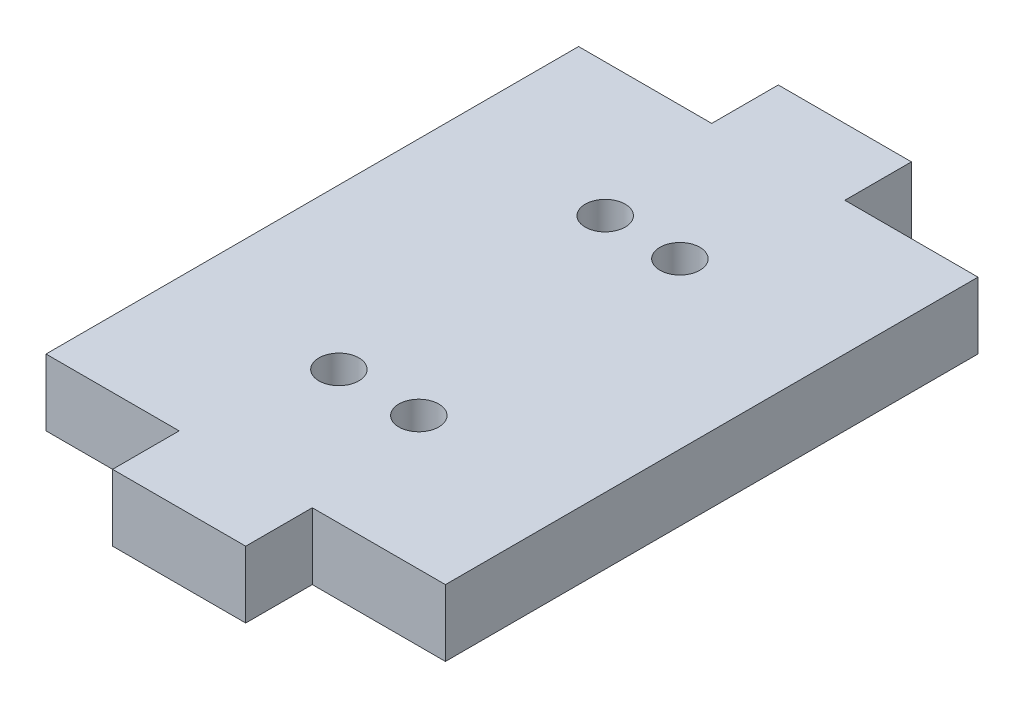
ISO-10303-21;
HEADER;
FILE_DESCRIPTION(('STEP AP214'),'2;1');
FILE_NAME('part.step','',(''),(''),'','','');
FILE_SCHEMA(('AUTOMOTIVE_DESIGN { 1 0 10303 214 1 1 1 1 }'));
ENDSEC;
DATA;
#1=APPLICATION_CONTEXT('core data for automotive mechanical design processes');
#2=APPLICATION_PROTOCOL_DEFINITION('international standard','automotive_design',2000,#1);
#3=PRODUCT_CONTEXT('',#1,'mechanical');
#4=PRODUCT('Part','Part','',(#3));
#5=PRODUCT_RELATED_PRODUCT_CATEGORY('part','',(#4));
#6=PRODUCT_DEFINITION_FORMATION('','',#4);
#7=PRODUCT_DEFINITION_CONTEXT('part definition',#1,'design');
#8=PRODUCT_DEFINITION('design','',#6,#7);
#9=PRODUCT_DEFINITION_SHAPE('','',#8);
#10=(LENGTH_UNIT() NAMED_UNIT(*) SI_UNIT(.MILLI.,.METRE.));
#11=(NAMED_UNIT(*) PLANE_ANGLE_UNIT() SI_UNIT($,.RADIAN.));
#12=(NAMED_UNIT(*) SI_UNIT($,.STERADIAN.) SOLID_ANGLE_UNIT());
#13=UNCERTAINTY_MEASURE_WITH_UNIT(LENGTH_MEASURE(1.E-05),#10,'distance_accuracy_value','');
#14=(GEOMETRIC_REPRESENTATION_CONTEXT(3) GLOBAL_UNCERTAINTY_ASSIGNED_CONTEXT((#13)) GLOBAL_UNIT_ASSIGNED_CONTEXT((#10,
#11,#12)) REPRESENTATION_CONTEXT('',''));
#15=CARTESIAN_POINT('',(0.,0.,0.));
#16=DIRECTION('',(0.,0.,1.));
#17=DIRECTION('',(1.,0.,0.));
#18=AXIS2_PLACEMENT_3D('',#15,#16,#17);
#19=CARTESIAN_POINT('',(0.,5.,0.));
#20=DIRECTION('',(0.,-1.,0.));
#21=DIRECTION('',(0.,0.,-1.));
#22=AXIS2_PLACEMENT_3D('',#19,#20,#21);
#23=PLANE('',#22);
#24=DIRECTION('',(0.,0.,1.));
#25=VECTOR('',#24,1.);
#26=CARTESIAN_POINT('',(0.,5.,0.));
#27=LINE('',#26,#25);
#28=CARTESIAN_POINT('',(0.,5.,-40.));
#29=VERTEX_POINT('',#28);
#30=CARTESIAN_POINT('',(0.,5.,0.));
#31=VERTEX_POINT('',#30);
#32=EDGE_CURVE('E179',#29,#31,#27,.T.);
#33=ORIENTED_EDGE('',*,*,#32,.T.);
#34=DIRECTION('',(1.,0.,0.));
#35=VECTOR('',#34,1.);
#36=CARTESIAN_POINT('',(0.,5.,0.));
#37=LINE('',#36,#35);
#38=CARTESIAN_POINT('',(9.99999999999999,5.,0.));
#39=VERTEX_POINT('',#38);
#40=EDGE_CURVE('E107',#31,#39,#37,.T.);
#41=ORIENTED_EDGE('',*,*,#40,.T.);
#42=DIRECTION('',(0.,0.,1.));
#43=VECTOR('',#42,1.);
#44=CARTESIAN_POINT('',(9.99999999999999,5.,0.));
#45=LINE('',#44,#43);
#46=CARTESIAN_POINT('',(10.,5.,5.));
#47=VERTEX_POINT('',#46);
#48=EDGE_CURVE('E206',#39,#47,#45,.T.);
#49=ORIENTED_EDGE('',*,*,#48,.T.);
#50=DIRECTION('',(1.,0.,0.));
#51=VECTOR('',#50,1.);
#52=CARTESIAN_POINT('',(10.,5.,5.));
#53=LINE('',#52,#51);
#54=CARTESIAN_POINT('',(20.,5.,5.));
#55=VERTEX_POINT('',#54);
#56=EDGE_CURVE('E225',#47,#55,#53,.T.);
#57=ORIENTED_EDGE('',*,*,#56,.T.);
#58=DIRECTION('',(0.,0.,-1.));
#59=VECTOR('',#58,1.);
#60=CARTESIAN_POINT('',(20.,5.,0.));
#61=LINE('',#60,#59);
#62=CARTESIAN_POINT('',(20.,5.,0.));
#63=VERTEX_POINT('',#62);
#64=EDGE_CURVE('E222',#55,#63,#61,.T.);
#65=ORIENTED_EDGE('',*,*,#64,.T.);
#66=DIRECTION('',(1.,0.,0.));
#67=VECTOR('',#66,1.);
#68=CARTESIAN_POINT('',(20.,5.,0.));
#69=LINE('',#68,#67);
#70=CARTESIAN_POINT('',(30.,5.,0.));
#71=VERTEX_POINT('',#70);
#72=EDGE_CURVE('E224',#63,#71,#69,.T.);
#73=ORIENTED_EDGE('',*,*,#72,.T.);
#74=DIRECTION('',(0.,0.,-1.));
#75=VECTOR('',#74,1.);
#76=CARTESIAN_POINT('',(30.,5.,0.));
#77=LINE('',#76,#75);
#78=CARTESIAN_POINT('',(30.,5.,-40.));
#79=VERTEX_POINT('',#78);
#80=EDGE_CURVE('E227',#71,#79,#77,.T.);
#81=ORIENTED_EDGE('',*,*,#80,.T.);
#82=DIRECTION('',(-1.,0.,0.));
#83=VECTOR('',#82,1.);
#84=CARTESIAN_POINT('',(20.,5.,-40.));
#85=LINE('',#84,#83);
#86=CARTESIAN_POINT('',(20.,5.,-40.));
#87=VERTEX_POINT('',#86);
#88=EDGE_CURVE('E233',#79,#87,#85,.T.);
#89=ORIENTED_EDGE('',*,*,#88,.T.);
#90=DIRECTION('',(0.,0.,-1.));
#91=VECTOR('',#90,1.);
#92=CARTESIAN_POINT('',(20.,5.,-40.));
#93=LINE('',#92,#91);
#94=CARTESIAN_POINT('',(20.,5.,-45.));
#95=VERTEX_POINT('',#94);
#96=EDGE_CURVE('E138',#87,#95,#93,.T.);
#97=ORIENTED_EDGE('',*,*,#96,.T.);
#98=DIRECTION('',(-1.,0.,0.));
#99=VECTOR('',#98,1.);
#100=CARTESIAN_POINT('',(9.99999999999999,5.,-45.));
#101=LINE('',#100,#99);
#102=CARTESIAN_POINT('',(9.99999999999999,5.,-45.));
#103=VERTEX_POINT('',#102);
#104=EDGE_CURVE('E132',#95,#103,#101,.T.);
#105=ORIENTED_EDGE('',*,*,#104,.T.);
#106=DIRECTION('',(0.,0.,1.));
#107=VECTOR('',#106,1.);
#108=CARTESIAN_POINT('',(9.99999999999999,5.,-40.));
#109=LINE('',#108,#107);
#110=CARTESIAN_POINT('',(9.99999999999999,5.,-40.));
#111=VERTEX_POINT('',#110);
#112=EDGE_CURVE('E136',#103,#111,#109,.T.);
#113=ORIENTED_EDGE('',*,*,#112,.T.);
#114=DIRECTION('',(-1.,0.,0.));
#115=VECTOR('',#114,1.);
#116=CARTESIAN_POINT('',(0.,5.,-40.));
#117=LINE('',#116,#115);
#118=EDGE_CURVE('E52',#111,#29,#117,.T.);
#119=ORIENTED_EDGE('',*,*,#118,.T.);
#120=EDGE_LOOP('',(#33,#41,#49,#57,#65,#73,#81,#89,#97,#105,#113,#119));
#121=FACE_BOUND('',#120,.T.);
#122=CARTESIAN_POINT('',(12.,5.,-30.));
#123=DIRECTION('',(0.,1.,0.));
#124=DIRECTION('',(0.,0.,1.));
#125=AXIS2_PLACEMENT_3D('',#122,#123,#124);
#126=CIRCLE('',#125,1.5);
#127=CARTESIAN_POINT('',(12.,5.,-28.5));
#128=VERTEX_POINT('',#127);
#129=EDGE_CURVE('E160',#128,#128,#126,.T.);
#130=ORIENTED_EDGE('',*,*,#129,.F.);
#131=EDGE_LOOP('',(#130));
#132=FACE_BOUND('',#131,.T.);
#133=CARTESIAN_POINT('',(17.6105034699835,5.,-30.));
#134=DIRECTION('',(0.,1.,0.));
#135=DIRECTION('',(0.,0.,1.));
#136=AXIS2_PLACEMENT_3D('',#133,#134,#135);
#137=CIRCLE('',#136,1.5);
#138=CARTESIAN_POINT('',(17.6105034699835,5.,-28.5));
#139=VERTEX_POINT('',#138);
#140=EDGE_CURVE('E297',#139,#139,#137,.T.);
#141=ORIENTED_EDGE('',*,*,#140,.F.);
#142=EDGE_LOOP('',(#141));
#143=FACE_BOUND('',#142,.T.);
#144=CARTESIAN_POINT('',(18.,5.,-10.));
#145=DIRECTION('',(0.,1.,0.));
#146=DIRECTION('',(0.,0.,1.));
#147=AXIS2_PLACEMENT_3D('',#144,#145,#146);
#148=CIRCLE('',#147,1.5);
#149=CARTESIAN_POINT('',(18.,5.,-8.5));
#150=VERTEX_POINT('',#149);
#151=EDGE_CURVE('E291',#150,#150,#148,.T.);
#152=ORIENTED_EDGE('',*,*,#151,.F.);
#153=EDGE_LOOP('',(#152));
#154=FACE_BOUND('',#153,.T.);
#155=CARTESIAN_POINT('',(12.,5.,-10.));
#156=DIRECTION('',(0.,1.,0.));
#157=DIRECTION('',(0.,0.,1.));
#158=AXIS2_PLACEMENT_3D('',#155,#156,#157);
#159=CIRCLE('',#158,1.5);
#160=CARTESIAN_POINT('',(12.,5.,-8.5));
#161=VERTEX_POINT('',#160);
#162=EDGE_CURVE('E282',#161,#161,#159,.T.);
#163=ORIENTED_EDGE('',*,*,#162,.F.);
#164=EDGE_LOOP('',(#163));
#165=FACE_BOUND('',#164,.T.);
#166=ADVANCED_FACE('F35',(#121,#132,#143,#154,#165),#23,.F.);
#167=CARTESIAN_POINT('',(0.,0.,0.));
#168=DIRECTION('',(0.,-1.,0.));
#169=DIRECTION('',(0.,0.,-1.));
#170=AXIS2_PLACEMENT_3D('',#167,#168,#169);
#171=PLANE('',#170);
#172=CARTESIAN_POINT('',(18.,0.,-10.));
#173=DIRECTION('',(0.,1.,0.));
#174=DIRECTION('',(0.,0.,1.));
#175=AXIS2_PLACEMENT_3D('',#172,#173,#174);
#176=CIRCLE('',#175,1.5);
#177=CARTESIAN_POINT('',(18.,0.,-8.5));
#178=VERTEX_POINT('',#177);
#179=EDGE_CURVE('E288',#178,#178,#176,.T.);
#180=ORIENTED_EDGE('',*,*,#179,.T.);
#181=EDGE_LOOP('',(#180));
#182=FACE_BOUND('',#181,.T.);
#183=CARTESIAN_POINT('',(12.,0.,-30.));
#184=DIRECTION('',(0.,1.,0.));
#185=DIRECTION('',(0.,0.,1.));
#186=AXIS2_PLACEMENT_3D('',#183,#184,#185);
#187=CIRCLE('',#186,1.5);
#188=CARTESIAN_POINT('',(12.,0.,-28.5));
#189=VERTEX_POINT('',#188);
#190=EDGE_CURVE('E300',#189,#189,#187,.T.);
#191=ORIENTED_EDGE('',*,*,#190,.T.);
#192=EDGE_LOOP('',(#191));
#193=FACE_BOUND('',#192,.T.);
#194=DIRECTION('',(0.,0.,1.));
#195=VECTOR('',#194,1.);
#196=CARTESIAN_POINT('',(0.,0.,0.));
#197=LINE('',#196,#195);
#198=CARTESIAN_POINT('',(0.,0.,-40.));
#199=VERTEX_POINT('',#198);
#200=CARTESIAN_POINT('',(0.,0.,0.));
#201=VERTEX_POINT('',#200);
#202=EDGE_CURVE('E156',#199,#201,#197,.T.);
#203=ORIENTED_EDGE('',*,*,#202,.F.);
#204=DIRECTION('',(-1.,0.,0.));
#205=VECTOR('',#204,1.);
#206=CARTESIAN_POINT('',(0.,0.,-40.));
#207=LINE('',#206,#205);
#208=CARTESIAN_POINT('',(9.99999999999999,0.,-40.));
#209=VERTEX_POINT('',#208);
#210=EDGE_CURVE('E99',#209,#199,#207,.T.);
#211=ORIENTED_EDGE('',*,*,#210,.F.);
#212=DIRECTION('',(0.,0.,1.));
#213=VECTOR('',#212,1.);
#214=CARTESIAN_POINT('',(9.99999999999999,0.,-40.));
#215=LINE('',#214,#213);
#216=CARTESIAN_POINT('',(9.99999999999999,0.,-45.));
#217=VERTEX_POINT('',#216);
#218=EDGE_CURVE('E93',#217,#209,#215,.T.);
#219=ORIENTED_EDGE('',*,*,#218,.F.);
#220=DIRECTION('',(-1.,0.,0.));
#221=VECTOR('',#220,1.);
#222=CARTESIAN_POINT('',(9.99999999999999,0.,-45.));
#223=LINE('',#222,#221);
#224=CARTESIAN_POINT('',(20.,0.,-45.));
#225=VERTEX_POINT('',#224);
#226=EDGE_CURVE('E146',#225,#217,#223,.T.);
#227=ORIENTED_EDGE('',*,*,#226,.F.);
#228=DIRECTION('',(0.,0.,-1.));
#229=VECTOR('',#228,1.);
#230=CARTESIAN_POINT('',(20.,0.,-40.));
#231=LINE('',#230,#229);
#232=CARTESIAN_POINT('',(20.,0.,-40.));
#233=VERTEX_POINT('',#232);
#234=EDGE_CURVE('E174',#233,#225,#231,.T.);
#235=ORIENTED_EDGE('',*,*,#234,.F.);
#236=DIRECTION('',(-1.,0.,0.));
#237=VECTOR('',#236,1.);
#238=CARTESIAN_POINT('',(20.,0.,-40.));
#239=LINE('',#238,#237);
#240=CARTESIAN_POINT('',(30.,0.,-40.));
#241=VERTEX_POINT('',#240);
#242=EDGE_CURVE('E172',#241,#233,#239,.T.);
#243=ORIENTED_EDGE('',*,*,#242,.F.);
#244=DIRECTION('',(0.,0.,-1.));
#245=VECTOR('',#244,1.);
#246=CARTESIAN_POINT('',(30.,0.,0.));
#247=LINE('',#246,#245);
#248=CARTESIAN_POINT('',(30.,0.,0.));
#249=VERTEX_POINT('',#248);
#250=EDGE_CURVE('E170',#249,#241,#247,.T.);
#251=ORIENTED_EDGE('',*,*,#250,.F.);
#252=DIRECTION('',(1.,0.,0.));
#253=VECTOR('',#252,1.);
#254=CARTESIAN_POINT('',(20.,0.,0.));
#255=LINE('',#254,#253);
#256=CARTESIAN_POINT('',(20.,0.,0.));
#257=VERTEX_POINT('',#256);
#258=EDGE_CURVE('E168',#257,#249,#255,.T.);
#259=ORIENTED_EDGE('',*,*,#258,.F.);
#260=DIRECTION('',(0.,0.,-1.));
#261=VECTOR('',#260,1.);
#262=CARTESIAN_POINT('',(20.,0.,0.));
#263=LINE('',#262,#261);
#264=CARTESIAN_POINT('',(20.,0.,5.));
#265=VERTEX_POINT('',#264);
#266=EDGE_CURVE('E166',#265,#257,#263,.T.);
#267=ORIENTED_EDGE('',*,*,#266,.F.);
#268=DIRECTION('',(1.,0.,0.));
#269=VECTOR('',#268,1.);
#270=CARTESIAN_POINT('',(10.,0.,5.));
#271=LINE('',#270,#269);
#272=CARTESIAN_POINT('',(10.,0.,5.));
#273=VERTEX_POINT('',#272);
#274=EDGE_CURVE('E164',#273,#265,#271,.T.);
#275=ORIENTED_EDGE('',*,*,#274,.F.);
#276=DIRECTION('',(0.,0.,1.));
#277=VECTOR('',#276,1.);
#278=CARTESIAN_POINT('',(9.99999999999999,0.,0.));
#279=LINE('',#278,#277);
#280=CARTESIAN_POINT('',(9.99999999999999,0.,0.));
#281=VERTEX_POINT('',#280);
#282=EDGE_CURVE('E162',#281,#273,#279,.T.);
#283=ORIENTED_EDGE('',*,*,#282,.F.);
#284=DIRECTION('',(1.,0.,0.));
#285=VECTOR('',#284,1.);
#286=CARTESIAN_POINT('',(0.,0.,0.));
#287=LINE('',#286,#285);
#288=EDGE_CURVE('E159',#201,#281,#287,.T.);
#289=ORIENTED_EDGE('',*,*,#288,.F.);
#290=EDGE_LOOP('',(#203,#211,#219,#227,#235,#243,#251,#259,#267,#275,#283,#289));
#291=FACE_BOUND('',#290,.T.);
#292=CARTESIAN_POINT('',(17.6105034699835,0.,-30.));
#293=DIRECTION('',(0.,1.,0.));
#294=DIRECTION('',(0.,0.,1.));
#295=AXIS2_PLACEMENT_3D('',#292,#293,#294);
#296=CIRCLE('',#295,1.5);
#297=CARTESIAN_POINT('',(17.6105034699835,0.,-28.5));
#298=VERTEX_POINT('',#297);
#299=EDGE_CURVE('E294',#298,#298,#296,.T.);
#300=ORIENTED_EDGE('',*,*,#299,.T.);
#301=EDGE_LOOP('',(#300));
#302=FACE_BOUND('',#301,.T.);
#303=CARTESIAN_POINT('',(12.,0.,-10.));
#304=DIRECTION('',(0.,1.,0.));
#305=DIRECTION('',(0.,0.,1.));
#306=AXIS2_PLACEMENT_3D('',#303,#304,#305);
#307=CIRCLE('',#306,1.5);
#308=CARTESIAN_POINT('',(12.,0.,-8.5));
#309=VERTEX_POINT('',#308);
#310=EDGE_CURVE('E285',#309,#309,#307,.T.);
#311=ORIENTED_EDGE('',*,*,#310,.T.);
#312=EDGE_LOOP('',(#311));
#313=FACE_BOUND('',#312,.T.);
#314=ADVANCED_FACE('F210',(#182,#193,#291,#302,#313),#171,.T.);
#315=CARTESIAN_POINT('',(0.,5.,0.));
#316=DIRECTION('',(1.,0.,0.));
#317=DIRECTION('',(0.,0.,-1.));
#318=AXIS2_PLACEMENT_3D('',#315,#316,#317);
#319=PLANE('',#318);
#320=ORIENTED_EDGE('',*,*,#202,.T.);
#321=DIRECTION('',(0.,-1.,0.));
#322=VECTOR('',#321,1.);
#323=CARTESIAN_POINT('',(0.,5.,0.));
#324=LINE('',#323,#322);
#325=EDGE_CURVE('E11',#31,#201,#324,.T.);
#326=ORIENTED_EDGE('',*,*,#325,.F.);
#327=ORIENTED_EDGE('',*,*,#32,.F.);
#328=DIRECTION('',(0.,-1.,0.));
#329=VECTOR('',#328,1.);
#330=CARTESIAN_POINT('',(0.,5.,-40.));
#331=LINE('',#330,#329);
#332=EDGE_CURVE('E152',#29,#199,#331,.T.);
#333=ORIENTED_EDGE('',*,*,#332,.T.);
#334=EDGE_LOOP('',(#320,#326,#327,#333));
#335=FACE_BOUND('',#334,.T.);
#336=ADVANCED_FACE('F37',(#335),#319,.F.);
#337=CARTESIAN_POINT('',(0.,5.,0.));
#338=DIRECTION('',(0.,0.,-1.));
#339=DIRECTION('',(-1.,0.,0.));
#340=AXIS2_PLACEMENT_3D('',#337,#338,#339);
#341=PLANE('',#340);
#342=ORIENTED_EDGE('',*,*,#288,.T.);
#343=DIRECTION('',(0.,-1.,0.));
#344=VECTOR('',#343,1.);
#345=CARTESIAN_POINT('',(9.99999999999999,5.,0.));
#346=LINE('',#345,#344);
#347=EDGE_CURVE('E44',#39,#281,#346,.T.);
#348=ORIENTED_EDGE('',*,*,#347,.F.);
#349=ORIENTED_EDGE('',*,*,#40,.F.);
#350=ORIENTED_EDGE('',*,*,#325,.T.);
#351=EDGE_LOOP('',(#342,#348,#349,#350));
#352=FACE_BOUND('',#351,.T.);
#353=ADVANCED_FACE('F412',(#352),#341,.F.);
#354=CARTESIAN_POINT('',(9.99999999999999,5.,0.));
#355=DIRECTION('',(1.,0.,0.));
#356=DIRECTION('',(0.,0.,-1.));
#357=AXIS2_PLACEMENT_3D('',#354,#355,#356);
#358=PLANE('',#357);
#359=ORIENTED_EDGE('',*,*,#282,.T.);
#360=DIRECTION('',(0.,-1.,0.));
#361=VECTOR('',#360,1.);
#362=CARTESIAN_POINT('',(10.,5.,5.));
#363=LINE('',#362,#361);
#364=EDGE_CURVE('E198',#47,#273,#363,.T.);
#365=ORIENTED_EDGE('',*,*,#364,.F.);
#366=ORIENTED_EDGE('',*,*,#48,.F.);
#367=ORIENTED_EDGE('',*,*,#347,.T.);
#368=EDGE_LOOP('',(#359,#365,#366,#367));
#369=FACE_BOUND('',#368,.T.);
#370=ADVANCED_FACE('F204',(#369),#358,.F.);
#371=CARTESIAN_POINT('',(10.,5.,5.));
#372=DIRECTION('',(0.,0.,-1.));
#373=DIRECTION('',(-1.,0.,0.));
#374=AXIS2_PLACEMENT_3D('',#371,#372,#373);
#375=PLANE('',#374);
#376=ORIENTED_EDGE('',*,*,#274,.T.);
#377=DIRECTION('',(0.,-1.,0.));
#378=VECTOR('',#377,1.);
#379=CARTESIAN_POINT('',(20.,5.,5.));
#380=LINE('',#379,#378);
#381=EDGE_CURVE('E195',#55,#265,#380,.T.);
#382=ORIENTED_EDGE('',*,*,#381,.F.);
#383=ORIENTED_EDGE('',*,*,#56,.F.);
#384=ORIENTED_EDGE('',*,*,#364,.T.);
#385=EDGE_LOOP('',(#376,#382,#383,#384));
#386=FACE_BOUND('',#385,.T.);
#387=ADVANCED_FACE('F216',(#386),#375,.F.);
#388=CARTESIAN_POINT('',(20.,5.,0.));
#389=DIRECTION('',(-1.,0.,0.));
#390=DIRECTION('',(0.,0.,1.));
#391=AXIS2_PLACEMENT_3D('',#388,#389,#390);
#392=PLANE('',#391);
#393=ORIENTED_EDGE('',*,*,#266,.T.);
#394=DIRECTION('',(0.,-1.,0.));
#395=VECTOR('',#394,1.);
#396=CARTESIAN_POINT('',(20.,5.,0.));
#397=LINE('',#396,#395);
#398=EDGE_CURVE('E192',#63,#257,#397,.T.);
#399=ORIENTED_EDGE('',*,*,#398,.F.);
#400=ORIENTED_EDGE('',*,*,#64,.F.);
#401=ORIENTED_EDGE('',*,*,#381,.T.);
#402=EDGE_LOOP('',(#393,#399,#400,#401));
#403=FACE_BOUND('',#402,.T.);
#404=ADVANCED_FACE('F220',(#403),#392,.F.);
#405=CARTESIAN_POINT('',(20.,5.,0.));
#406=DIRECTION('',(0.,0.,-1.));
#407=DIRECTION('',(-1.,0.,0.));
#408=AXIS2_PLACEMENT_3D('',#405,#406,#407);
#409=PLANE('',#408);
#410=ORIENTED_EDGE('',*,*,#258,.T.);
#411=DIRECTION('',(0.,-1.,0.));
#412=VECTOR('',#411,1.);
#413=CARTESIAN_POINT('',(30.,5.,0.));
#414=LINE('',#413,#412);
#415=EDGE_CURVE('E189',#71,#249,#414,.T.);
#416=ORIENTED_EDGE('',*,*,#415,.F.);
#417=ORIENTED_EDGE('',*,*,#72,.F.);
#418=ORIENTED_EDGE('',*,*,#398,.T.);
#419=EDGE_LOOP('',(#410,#416,#417,#418));
#420=FACE_BOUND('',#419,.T.);
#421=ADVANCED_FACE('F377',(#420),#409,.F.);
#422=CARTESIAN_POINT('',(30.,5.,0.));
#423=DIRECTION('',(-1.,0.,0.));
#424=DIRECTION('',(0.,0.,1.));
#425=AXIS2_PLACEMENT_3D('',#422,#423,#424);
#426=PLANE('',#425);
#427=ORIENTED_EDGE('',*,*,#250,.T.);
#428=DIRECTION('',(0.,-1.,0.));
#429=VECTOR('',#428,1.);
#430=CARTESIAN_POINT('',(30.,5.,-40.));
#431=LINE('',#430,#429);
#432=EDGE_CURVE('E186',#79,#241,#431,.T.);
#433=ORIENTED_EDGE('',*,*,#432,.F.);
#434=ORIENTED_EDGE('',*,*,#80,.F.);
#435=ORIENTED_EDGE('',*,*,#415,.T.);
#436=EDGE_LOOP('',(#427,#433,#434,#435));
#437=FACE_BOUND('',#436,.T.);
#438=ADVANCED_FACE('F368',(#437),#426,.F.);
#439=CARTESIAN_POINT('',(20.,5.,-40.));
#440=DIRECTION('',(0.,0.,1.));
#441=DIRECTION('',(1.,0.,0.));
#442=AXIS2_PLACEMENT_3D('',#439,#440,#441);
#443=PLANE('',#442);
#444=ORIENTED_EDGE('',*,*,#242,.T.);
#445=DIRECTION('',(0.,-1.,0.));
#446=VECTOR('',#445,1.);
#447=CARTESIAN_POINT('',(20.,5.,-40.));
#448=LINE('',#447,#446);
#449=EDGE_CURVE('E183',#87,#233,#448,.T.);
#450=ORIENTED_EDGE('',*,*,#449,.F.);
#451=ORIENTED_EDGE('',*,*,#88,.F.);
#452=ORIENTED_EDGE('',*,*,#432,.T.);
#453=EDGE_LOOP('',(#444,#450,#451,#452));
#454=FACE_BOUND('',#453,.T.);
#455=ADVANCED_FACE('F239',(#454),#443,.F.);
#456=CARTESIAN_POINT('',(20.,5.,-40.));
#457=DIRECTION('',(-1.,0.,0.));
#458=DIRECTION('',(0.,0.,1.));
#459=AXIS2_PLACEMENT_3D('',#456,#457,#458);
#460=PLANE('',#459);
#461=ORIENTED_EDGE('',*,*,#234,.T.);
#462=DIRECTION('',(0.,-1.,0.));
#463=VECTOR('',#462,1.);
#464=CARTESIAN_POINT('',(20.,5.,-45.));
#465=LINE('',#464,#463);
#466=EDGE_CURVE('E147',#95,#225,#465,.T.);
#467=ORIENTED_EDGE('',*,*,#466,.F.);
#468=ORIENTED_EDGE('',*,*,#96,.F.);
#469=ORIENTED_EDGE('',*,*,#449,.T.);
#470=EDGE_LOOP('',(#461,#467,#468,#469));
#471=FACE_BOUND('',#470,.T.);
#472=ADVANCED_FACE('F243',(#471),#460,.F.);
#473=CARTESIAN_POINT('',(9.99999999999999,5.,-45.));
#474=DIRECTION('',(0.,0.,1.));
#475=DIRECTION('',(1.,0.,0.));
#476=AXIS2_PLACEMENT_3D('',#473,#474,#475);
#477=PLANE('',#476);
#478=ORIENTED_EDGE('',*,*,#226,.T.);
#479=DIRECTION('',(0.,-1.,0.));
#480=VECTOR('',#479,1.);
#481=CARTESIAN_POINT('',(9.99999999999999,5.,-45.));
#482=LINE('',#481,#480);
#483=EDGE_CURVE('E143',#103,#217,#482,.T.);
#484=ORIENTED_EDGE('',*,*,#483,.F.);
#485=ORIENTED_EDGE('',*,*,#104,.F.);
#486=ORIENTED_EDGE('',*,*,#466,.T.);
#487=EDGE_LOOP('',(#478,#484,#485,#486));
#488=FACE_BOUND('',#487,.T.);
#489=ADVANCED_FACE('F144',(#488),#477,.F.);
#490=CARTESIAN_POINT('',(9.99999999999999,5.,-40.));
#491=DIRECTION('',(1.,0.,0.));
#492=DIRECTION('',(0.,0.,-1.));
#493=AXIS2_PLACEMENT_3D('',#490,#491,#492);
#494=PLANE('',#493);
#495=ORIENTED_EDGE('',*,*,#218,.T.);
#496=DIRECTION('',(0.,-1.,0.));
#497=VECTOR('',#496,1.);
#498=CARTESIAN_POINT('',(9.99999999999999,5.,-40.));
#499=LINE('',#498,#497);
#500=EDGE_CURVE('E148',#111,#209,#499,.T.);
#501=ORIENTED_EDGE('',*,*,#500,.F.);
#502=ORIENTED_EDGE('',*,*,#112,.F.);
#503=ORIENTED_EDGE('',*,*,#483,.T.);
#504=EDGE_LOOP('',(#495,#501,#502,#503));
#505=FACE_BOUND('',#504,.T.);
#506=ADVANCED_FACE('F150',(#505),#494,.F.);
#507=CARTESIAN_POINT('',(0.,5.,-40.));
#508=DIRECTION('',(0.,0.,1.));
#509=DIRECTION('',(1.,0.,0.));
#510=AXIS2_PLACEMENT_3D('',#507,#508,#509);
#511=PLANE('',#510);
#512=ORIENTED_EDGE('',*,*,#210,.T.);
#513=ORIENTED_EDGE('',*,*,#332,.F.);
#514=ORIENTED_EDGE('',*,*,#118,.F.);
#515=ORIENTED_EDGE('',*,*,#500,.T.);
#516=EDGE_LOOP('',(#512,#513,#514,#515));
#517=FACE_BOUND('',#516,.T.);
#518=ADVANCED_FACE('F247',(#517),#511,.F.);
#519=CARTESIAN_POINT('',(12.,5.,-30.));
#520=DIRECTION('',(0.,-1.,0.));
#521=DIRECTION('',(0.,0.,-1.));
#522=AXIS2_PLACEMENT_3D('',#519,#520,#521);
#523=CYLINDRICAL_SURFACE('',#522,1.5);
#524=ORIENTED_EDGE('',*,*,#129,.T.);
#525=EDGE_LOOP('',(#524));
#526=FACE_BOUND('',#525,.T.);
#527=ORIENTED_EDGE('',*,*,#190,.F.);
#528=EDGE_LOOP('',(#527));
#529=FACE_BOUND('',#528,.T.);
#530=ADVANCED_FACE('F249',(#526,#529),#523,.F.);
#531=CARTESIAN_POINT('',(17.6105034699835,5.,-30.));
#532=DIRECTION('',(0.,-1.,0.));
#533=DIRECTION('',(0.,0.,-1.));
#534=AXIS2_PLACEMENT_3D('',#531,#532,#533);
#535=CYLINDRICAL_SURFACE('',#534,1.5);
#536=ORIENTED_EDGE('',*,*,#140,.T.);
#537=EDGE_LOOP('',(#536));
#538=FACE_BOUND('',#537,.T.);
#539=ORIENTED_EDGE('',*,*,#299,.F.);
#540=EDGE_LOOP('',(#539));
#541=FACE_BOUND('',#540,.T.);
#542=ADVANCED_FACE('F255',(#538,#541),#535,.F.);
#543=CARTESIAN_POINT('',(18.,5.,-10.));
#544=DIRECTION('',(0.,-1.,0.));
#545=DIRECTION('',(0.,0.,-1.));
#546=AXIS2_PLACEMENT_3D('',#543,#544,#545);
#547=CYLINDRICAL_SURFACE('',#546,1.5);
#548=ORIENTED_EDGE('',*,*,#151,.T.);
#549=EDGE_LOOP('',(#548));
#550=FACE_BOUND('',#549,.T.);
#551=ORIENTED_EDGE('',*,*,#179,.F.);
#552=EDGE_LOOP('',(#551));
#553=FACE_BOUND('',#552,.T.);
#554=ADVANCED_FACE('F269',(#550,#553),#547,.F.);
#555=CARTESIAN_POINT('',(12.,5.,-10.));
#556=DIRECTION('',(0.,-1.,0.));
#557=DIRECTION('',(0.,0.,-1.));
#558=AXIS2_PLACEMENT_3D('',#555,#556,#557);
#559=CYLINDRICAL_SURFACE('',#558,1.5);
#560=ORIENTED_EDGE('',*,*,#162,.T.);
#561=EDGE_LOOP('',(#560));
#562=FACE_BOUND('',#561,.T.);
#563=ORIENTED_EDGE('',*,*,#310,.F.);
#564=EDGE_LOOP('',(#563));
#565=FACE_BOUND('',#564,.T.);
#566=ADVANCED_FACE('F273',(#562,#565),#559,.F.);
#567=CLOSED_SHELL('',(#166,#314,#336,#353,#370,#387,#404,#421,#438,#455,#472,#489,#506,#518,
#530,#542,#554,#566));
#568=MANIFOLD_SOLID_BREP('B2',#567);
#569=ADVANCED_BREP_SHAPE_REPRESENTATION('',(#18,#568),#14);
#570=SHAPE_DEFINITION_REPRESENTATION(#9,#569);
ENDSEC;
END-ISO-10303-21;
